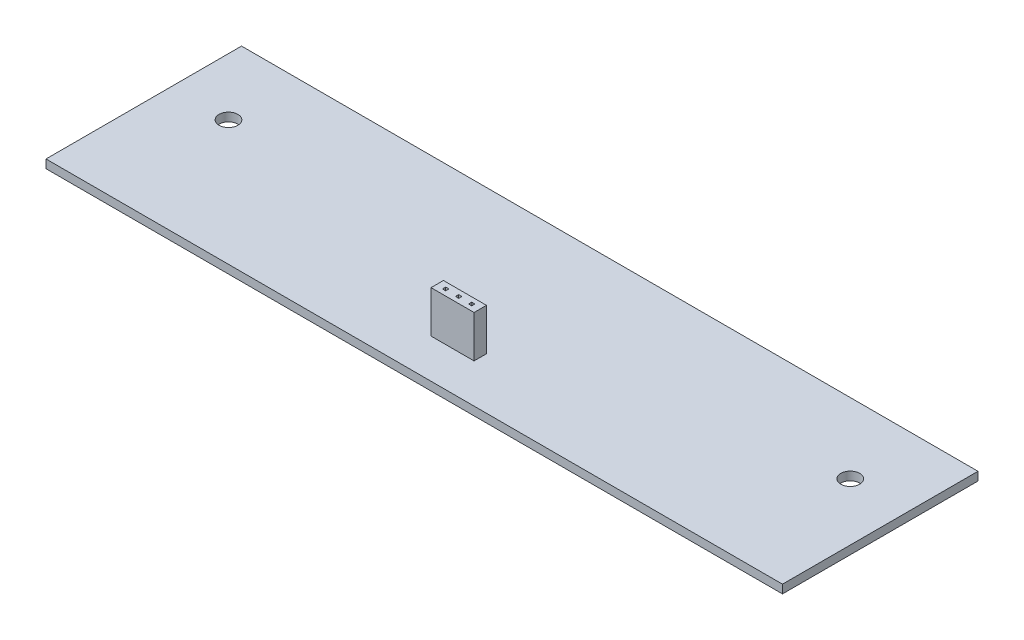
ISO-10303-21;
HEADER;
FILE_DESCRIPTION(('STEP AP214'),'2;1');
FILE_NAME('part.step','',(''),(''),'','','');
FILE_SCHEMA(('AUTOMOTIVE_DESIGN { 1 0 10303 214 1 1 1 1 }'));
ENDSEC;
DATA;
#1=APPLICATION_CONTEXT('core data for automotive mechanical design processes');
#2=APPLICATION_PROTOCOL_DEFINITION('international standard','automotive_design',2000,#1);
#3=PRODUCT_CONTEXT('',#1,'mechanical');
#4=PRODUCT('Part','Part','',(#3));
#5=PRODUCT_RELATED_PRODUCT_CATEGORY('part','',(#4));
#6=PRODUCT_DEFINITION_FORMATION('','',#4);
#7=PRODUCT_DEFINITION_CONTEXT('part definition',#1,'design');
#8=PRODUCT_DEFINITION('design','',#6,#7);
#9=PRODUCT_DEFINITION_SHAPE('','',#8);
#10=(LENGTH_UNIT() NAMED_UNIT(*) SI_UNIT(.MILLI.,.METRE.));
#11=(NAMED_UNIT(*) PLANE_ANGLE_UNIT() SI_UNIT($,.RADIAN.));
#12=(NAMED_UNIT(*) SI_UNIT($,.STERADIAN.) SOLID_ANGLE_UNIT());
#13=UNCERTAINTY_MEASURE_WITH_UNIT(LENGTH_MEASURE(1.E-05),#10,'distance_accuracy_value','');
#14=(GEOMETRIC_REPRESENTATION_CONTEXT(3) GLOBAL_UNCERTAINTY_ASSIGNED_CONTEXT((#13)) GLOBAL_UNIT_ASSIGNED_CONTEXT((#10,
#11,#12)) REPRESENTATION_CONTEXT('',''));
#15=CARTESIAN_POINT('',(0.,0.,0.));
#16=DIRECTION('',(0.,0.,1.));
#17=DIRECTION('',(1.,0.,0.));
#18=AXIS2_PLACEMENT_3D('',#15,#16,#17);
#19=CARTESIAN_POINT('',(71.755,1.651,-19.05));
#20=DIRECTION('',(-1.,0.,0.));
#21=DIRECTION('',(0.,0.,1.));
#22=AXIS2_PLACEMENT_3D('',#19,#20,#21);
#23=PLANE('',#22);
#24=DIRECTION('',(0.,0.,-1.));
#25=VECTOR('',#24,1.);
#26=CARTESIAN_POINT('',(71.755,0.,-19.05));
#27=LINE('',#26,#25);
#28=CARTESIAN_POINT('',(71.755,0.,19.05));
#29=VERTEX_POINT('',#28);
#30=CARTESIAN_POINT('',(71.755,0.,-19.05));
#31=VERTEX_POINT('',#30);
#32=EDGE_CURVE('E362',#29,#31,#27,.T.);
#33=ORIENTED_EDGE('',*,*,#32,.T.);
#34=DIRECTION('',(0.,-1.,0.));
#35=VECTOR('',#34,1.);
#36=CARTESIAN_POINT('',(71.755,1.651,-19.05));
#37=LINE('',#36,#35);
#38=CARTESIAN_POINT('',(71.755,1.651,-19.05));
#39=VERTEX_POINT('',#38);
#40=EDGE_CURVE('E11',#39,#31,#37,.T.);
#41=ORIENTED_EDGE('',*,*,#40,.F.);
#42=DIRECTION('',(0.,0.,-1.));
#43=VECTOR('',#42,1.);
#44=CARTESIAN_POINT('',(71.755,1.651,-19.05));
#45=LINE('',#44,#43);
#46=CARTESIAN_POINT('',(71.755,1.651,19.05));
#47=VERTEX_POINT('',#46);
#48=EDGE_CURVE('E374',#47,#39,#45,.T.);
#49=ORIENTED_EDGE('',*,*,#48,.F.);
#50=DIRECTION('',(0.,-1.,0.));
#51=VECTOR('',#50,1.);
#52=CARTESIAN_POINT('',(71.755,1.651,19.05));
#53=LINE('',#52,#51);
#54=EDGE_CURVE('E388',#47,#29,#53,.T.);
#55=ORIENTED_EDGE('',*,*,#54,.T.);
#56=EDGE_LOOP('',(#33,#41,#49,#55));
#57=FACE_BOUND('',#56,.T.);
#58=ADVANCED_FACE('F47',(#57),#23,.F.);
#59=CARTESIAN_POINT('',(-71.755,1.651,-19.05));
#60=DIRECTION('',(0.,0.,1.));
#61=DIRECTION('',(1.,0.,0.));
#62=AXIS2_PLACEMENT_3D('',#59,#60,#61);
#63=PLANE('',#62);
#64=DIRECTION('',(-1.,0.,0.));
#65=VECTOR('',#64,1.);
#66=CARTESIAN_POINT('',(-71.755,0.,-19.05));
#67=LINE('',#66,#65);
#68=CARTESIAN_POINT('',(-71.755,0.,-19.05));
#69=VERTEX_POINT('',#68);
#70=EDGE_CURVE('E392',#31,#69,#67,.T.);
#71=ORIENTED_EDGE('',*,*,#70,.T.);
#72=DIRECTION('',(0.,-1.,0.));
#73=VECTOR('',#72,1.);
#74=CARTESIAN_POINT('',(-71.755,1.651,-19.05));
#75=LINE('',#74,#73);
#76=CARTESIAN_POINT('',(-71.755,1.651,-19.05));
#77=VERTEX_POINT('',#76);
#78=EDGE_CURVE('E55',#77,#69,#75,.T.);
#79=ORIENTED_EDGE('',*,*,#78,.F.);
#80=DIRECTION('',(-1.,0.,0.));
#81=VECTOR('',#80,1.);
#82=CARTESIAN_POINT('',(-71.755,1.651,-19.05));
#83=LINE('',#82,#81);
#84=EDGE_CURVE('E378',#39,#77,#83,.T.);
#85=ORIENTED_EDGE('',*,*,#84,.F.);
#86=ORIENTED_EDGE('',*,*,#40,.T.);
#87=EDGE_LOOP('',(#71,#79,#85,#86));
#88=FACE_BOUND('',#87,.T.);
#89=ADVANCED_FACE('F428',(#88),#63,.F.);
#90=CARTESIAN_POINT('',(-71.755,1.651,-19.05));
#91=DIRECTION('',(1.,0.,0.));
#92=DIRECTION('',(0.,0.,-1.));
#93=AXIS2_PLACEMENT_3D('',#90,#91,#92);
#94=PLANE('',#93);
#95=DIRECTION('',(0.,0.,1.));
#96=VECTOR('',#95,1.);
#97=CARTESIAN_POINT('',(-71.755,0.,-19.05));
#98=LINE('',#97,#96);
#99=CARTESIAN_POINT('',(-71.755,0.,19.05));
#100=VERTEX_POINT('',#99);
#101=EDGE_CURVE('E395',#69,#100,#98,.T.);
#102=ORIENTED_EDGE('',*,*,#101,.T.);
#103=DIRECTION('',(0.,-1.,0.));
#104=VECTOR('',#103,1.);
#105=CARTESIAN_POINT('',(-71.755,1.651,19.05));
#106=LINE('',#105,#104);
#107=CARTESIAN_POINT('',(-71.755,1.651,19.05));
#108=VERTEX_POINT('',#107);
#109=EDGE_CURVE('E403',#108,#100,#106,.T.);
#110=ORIENTED_EDGE('',*,*,#109,.F.);
#111=DIRECTION('',(0.,0.,1.));
#112=VECTOR('',#111,1.);
#113=CARTESIAN_POINT('',(-71.755,1.651,-19.05));
#114=LINE('',#113,#112);
#115=EDGE_CURVE('E382',#77,#108,#114,.T.);
#116=ORIENTED_EDGE('',*,*,#115,.F.);
#117=ORIENTED_EDGE('',*,*,#78,.T.);
#118=EDGE_LOOP('',(#102,#110,#116,#117));
#119=FACE_BOUND('',#118,.T.);
#120=ADVANCED_FACE('F412',(#119),#94,.F.);
#121=CARTESIAN_POINT('',(-71.755,1.651,19.05));
#122=DIRECTION('',(0.,0.,-1.));
#123=DIRECTION('',(-1.,0.,0.));
#124=AXIS2_PLACEMENT_3D('',#121,#122,#123);
#125=PLANE('',#124);
#126=DIRECTION('',(1.,0.,0.));
#127=VECTOR('',#126,1.);
#128=CARTESIAN_POINT('',(-71.755,0.,19.05));
#129=LINE('',#128,#127);
#130=EDGE_CURVE('E379',#100,#29,#129,.T.);
#131=ORIENTED_EDGE('',*,*,#130,.T.);
#132=ORIENTED_EDGE('',*,*,#54,.F.);
#133=DIRECTION('',(1.,0.,0.));
#134=VECTOR('',#133,1.);
#135=CARTESIAN_POINT('',(-71.755,1.651,19.05));
#136=LINE('',#135,#134);
#137=EDGE_CURVE('E385',#108,#47,#136,.T.);
#138=ORIENTED_EDGE('',*,*,#137,.F.);
#139=ORIENTED_EDGE('',*,*,#109,.T.);
#140=EDGE_LOOP('',(#131,#132,#138,#139));
#141=FACE_BOUND('',#140,.T.);
#142=ADVANCED_FACE('F421',(#141),#125,.F.);
#143=CARTESIAN_POINT('',(0.,1.651,0.));
#144=DIRECTION('',(0.,1.,0.));
#145=DIRECTION('',(0.,0.,1.));
#146=AXIS2_PLACEMENT_3D('',#143,#144,#145);
#147=PLANE('',#146);
#148=DIRECTION('',(0.,0.,-1.));
#149=VECTOR('',#148,1.);
#150=CARTESIAN_POINT('',(-4.34569858588176,1.651,0.));
#151=LINE('',#150,#149);
#152=CARTESIAN_POINT('',(-4.34569858588176,1.651,11.43));
#153=VERTEX_POINT('',#152);
#154=CARTESIAN_POINT('',(-4.34569858588176,1.651,9.017));
#155=VERTEX_POINT('',#154);
#156=EDGE_CURVE('E304',#153,#155,#151,.T.);
#157=ORIENTED_EDGE('',*,*,#156,.T.);
#158=DIRECTION('',(1.,0.,0.));
#159=VECTOR('',#158,1.);
#160=CARTESIAN_POINT('',(0.,1.651,9.017));
#161=LINE('',#160,#159);
#162=CARTESIAN_POINT('',(4.03630141411824,1.651,9.017));
#163=VERTEX_POINT('',#162);
#164=EDGE_CURVE('E319',#155,#163,#161,.T.);
#165=ORIENTED_EDGE('',*,*,#164,.T.);
#166=DIRECTION('',(0.,0.,1.));
#167=VECTOR('',#166,1.);
#168=CARTESIAN_POINT('',(4.03630141411824,1.651,0.));
#169=LINE('',#168,#167);
#170=CARTESIAN_POINT('',(4.03630141411824,1.651,11.43));
#171=VERTEX_POINT('',#170);
#172=EDGE_CURVE('E337',#163,#171,#169,.T.);
#173=ORIENTED_EDGE('',*,*,#172,.T.);
#174=DIRECTION('',(1.,0.,0.));
#175=VECTOR('',#174,1.);
#176=CARTESIAN_POINT('',(0.,1.651,11.43));
#177=LINE('',#176,#175);
#178=EDGE_CURVE('E333',#153,#171,#177,.T.);
#179=ORIENTED_EDGE('',*,*,#178,.F.);
#180=EDGE_LOOP('',(#157,#165,#173,#179));
#181=FACE_BOUND('',#180,.T.);
#182=CARTESIAN_POINT('',(60.579,1.651,-5.334));
#183=DIRECTION('',(0.,1.,0.));
#184=DIRECTION('',(0.,0.,1.));
#185=AXIS2_PLACEMENT_3D('',#182,#183,#184);
#186=CIRCLE('',#185,1.8415);
#187=CARTESIAN_POINT('',(60.579,1.651,-3.4925));
#188=VERTEX_POINT('',#187);
#189=EDGE_CURVE('E363',#188,#188,#186,.T.);
#190=ORIENTED_EDGE('',*,*,#189,.F.);
#191=EDGE_LOOP('',(#190));
#192=FACE_BOUND('',#191,.T.);
#193=CARTESIAN_POINT('',(-60.579,1.651,-5.334));
#194=DIRECTION('',(0.,1.,0.));
#195=DIRECTION('',(0.,0.,-1.));
#196=AXIS2_PLACEMENT_3D('',#193,#194,#195);
#197=CIRCLE('',#196,1.8415);
#198=CARTESIAN_POINT('',(-60.579,1.651,-3.4925));
#199=VERTEX_POINT('',#198);
#200=EDGE_CURVE('E367',#199,#199,#197,.T.);
#201=ORIENTED_EDGE('',*,*,#200,.F.);
#202=EDGE_LOOP('',(#201));
#203=FACE_BOUND('',#202,.T.);
#204=ORIENTED_EDGE('',*,*,#48,.T.);
#205=ORIENTED_EDGE('',*,*,#84,.T.);
#206=ORIENTED_EDGE('',*,*,#115,.T.);
#207=ORIENTED_EDGE('',*,*,#137,.T.);
#208=EDGE_LOOP('',(#204,#205,#206,#207));
#209=FACE_BOUND('',#208,.T.);
#210=ADVANCED_FACE('F427',(#181,#192,#203,#209),#147,.T.);
#211=CARTESIAN_POINT('',(0.,0.,0.));
#212=DIRECTION('',(0.,1.,0.));
#213=DIRECTION('',(0.,0.,1.));
#214=AXIS2_PLACEMENT_3D('',#211,#212,#213);
#215=PLANE('',#214);
#216=CARTESIAN_POINT('',(60.579,0.,-5.334));
#217=DIRECTION('',(0.,1.,0.));
#218=DIRECTION('',(0.,0.,1.));
#219=AXIS2_PLACEMENT_3D('',#216,#217,#218);
#220=CIRCLE('',#219,1.8415);
#221=CARTESIAN_POINT('',(60.579,0.,-3.4925));
#222=VERTEX_POINT('',#221);
#223=EDGE_CURVE('E358',#222,#222,#220,.T.);
#224=ORIENTED_EDGE('',*,*,#223,.T.);
#225=EDGE_LOOP('',(#224));
#226=FACE_BOUND('',#225,.T.);
#227=CARTESIAN_POINT('',(-60.579,0.,-5.334));
#228=DIRECTION('',(0.,1.,0.));
#229=DIRECTION('',(0.,0.,-1.));
#230=AXIS2_PLACEMENT_3D('',#227,#228,#229);
#231=CIRCLE('',#230,1.8415);
#232=CARTESIAN_POINT('',(-60.579,0.,-3.4925));
#233=VERTEX_POINT('',#232);
#234=EDGE_CURVE('E357',#233,#233,#231,.T.);
#235=ORIENTED_EDGE('',*,*,#234,.T.);
#236=EDGE_LOOP('',(#235));
#237=FACE_BOUND('',#236,.T.);
#238=ORIENTED_EDGE('',*,*,#32,.F.);
#239=ORIENTED_EDGE('',*,*,#130,.F.);
#240=ORIENTED_EDGE('',*,*,#101,.F.);
#241=ORIENTED_EDGE('',*,*,#70,.F.);
#242=EDGE_LOOP('',(#238,#239,#240,#241));
#243=FACE_BOUND('',#242,.T.);
#244=ADVANCED_FACE('F418',(#226,#237,#243),#215,.F.);
#245=CARTESIAN_POINT('',(-60.579,0.,-5.334));
#246=DIRECTION('',(0.,1.,0.));
#247=DIRECTION('',(0.,0.,1.));
#248=AXIS2_PLACEMENT_3D('',#245,#246,#247);
#249=CYLINDRICAL_SURFACE('',#248,1.8415);
#250=CARTESIAN_POINT('',(-60.579,0.,-3.4925));
#251=CARTESIAN_POINT('',(-60.579,0.0171979166666667,-3.4925));
#252=CARTESIAN_POINT('',(-60.579,0.0343958333333333,-3.4925));
#253=CARTESIAN_POINT('',(-60.579,0.0687916666666667,-3.4925));
#254=CARTESIAN_POINT('',(-60.579,0.0859895833333333,-3.4925));
#255=CARTESIAN_POINT('',(-60.579,0.120385416666667,-3.4925));
#256=CARTESIAN_POINT('',(-60.579,0.137583333333333,-3.4925));
#257=CARTESIAN_POINT('',(-60.579,0.171979166666667,-3.4925));
#258=CARTESIAN_POINT('',(-60.579,0.189177083333333,-3.4925));
#259=CARTESIAN_POINT('',(-60.579,0.223572916666667,-3.4925));
#260=CARTESIAN_POINT('',(-60.579,0.240770833333333,-3.4925));
#261=CARTESIAN_POINT('',(-60.579,0.275166666666667,-3.4925));
#262=CARTESIAN_POINT('',(-60.579,0.292364583333333,-3.4925));
#263=CARTESIAN_POINT('',(-60.579,0.326760416666667,-3.4925));
#264=CARTESIAN_POINT('',(-60.579,0.343958333333333,-3.4925));
#265=CARTESIAN_POINT('',(-60.579,0.378354166666667,-3.4925));
#266=CARTESIAN_POINT('',(-60.579,0.395552083333333,-3.4925));
#267=CARTESIAN_POINT('',(-60.579,0.429947916666667,-3.4925));
#268=CARTESIAN_POINT('',(-60.579,0.447145833333333,-3.4925));
#269=CARTESIAN_POINT('',(-60.579,0.481541666666667,-3.4925));
#270=CARTESIAN_POINT('',(-60.579,0.498739583333333,-3.4925));
#271=CARTESIAN_POINT('',(-60.579,0.533135416666667,-3.4925));
#272=CARTESIAN_POINT('',(-60.579,0.550333333333333,-3.4925));
#273=CARTESIAN_POINT('',(-60.579,0.584729166666667,-3.4925));
#274=CARTESIAN_POINT('',(-60.579,0.601927083333333,-3.4925));
#275=CARTESIAN_POINT('',(-60.579,0.636322916666667,-3.4925));
#276=CARTESIAN_POINT('',(-60.579,0.653520833333333,-3.4925));
#277=CARTESIAN_POINT('',(-60.579,0.687916666666667,-3.4925));
#278=CARTESIAN_POINT('',(-60.579,0.705114583333333,-3.4925));
#279=CARTESIAN_POINT('',(-60.579,0.739510416666667,-3.4925));
#280=CARTESIAN_POINT('',(-60.579,0.756708333333333,-3.4925));
#281=CARTESIAN_POINT('',(-60.579,0.791104166666667,-3.4925));
#282=CARTESIAN_POINT('',(-60.579,0.808302083333333,-3.4925));
#283=CARTESIAN_POINT('',(-60.579,0.842697916666667,-3.4925));
#284=CARTESIAN_POINT('',(-60.579,0.859895833333333,-3.4925));
#285=CARTESIAN_POINT('',(-60.579,0.894291666666667,-3.4925));
#286=CARTESIAN_POINT('',(-60.579,0.911489583333333,-3.4925));
#287=CARTESIAN_POINT('',(-60.579,0.945885416666667,-3.4925));
#288=CARTESIAN_POINT('',(-60.579,0.963083333333333,-3.4925));
#289=CARTESIAN_POINT('',(-60.579,0.997479166666666,-3.4925));
#290=CARTESIAN_POINT('',(-60.579,1.01467708333333,-3.4925));
#291=CARTESIAN_POINT('',(-60.579,1.04907291666667,-3.4925));
#292=CARTESIAN_POINT('',(-60.579,1.06627083333333,-3.4925));
#293=CARTESIAN_POINT('',(-60.579,1.10066666666667,-3.4925));
#294=CARTESIAN_POINT('',(-60.579,1.11786458333333,-3.4925));
#295=CARTESIAN_POINT('',(-60.579,1.15226041666667,-3.4925));
#296=CARTESIAN_POINT('',(-60.579,1.16945833333333,-3.4925));
#297=CARTESIAN_POINT('',(-60.579,1.20385416666667,-3.4925));
#298=CARTESIAN_POINT('',(-60.579,1.22105208333333,-3.4925));
#299=CARTESIAN_POINT('',(-60.579,1.25544791666667,-3.4925));
#300=CARTESIAN_POINT('',(-60.579,1.27264583333333,-3.4925));
#301=CARTESIAN_POINT('',(-60.579,1.30704166666667,-3.4925));
#302=CARTESIAN_POINT('',(-60.579,1.32423958333333,-3.4925));
#303=CARTESIAN_POINT('',(-60.579,1.35863541666667,-3.4925));
#304=CARTESIAN_POINT('',(-60.579,1.37583333333333,-3.4925));
#305=CARTESIAN_POINT('',(-60.579,1.41022916666667,-3.4925));
#306=CARTESIAN_POINT('',(-60.579,1.42742708333333,-3.4925));
#307=CARTESIAN_POINT('',(-60.579,1.46182291666667,-3.4925));
#308=CARTESIAN_POINT('',(-60.579,1.47902083333333,-3.4925));
#309=CARTESIAN_POINT('',(-60.579,1.51341666666667,-3.4925));
#310=CARTESIAN_POINT('',(-60.579,1.53061458333333,-3.4925));
#311=CARTESIAN_POINT('',(-60.579,1.56501041666667,-3.4925));
#312=CARTESIAN_POINT('',(-60.579,1.58220833333333,-3.4925));
#313=CARTESIAN_POINT('',(-60.579,1.61660416666667,-3.4925));
#314=CARTESIAN_POINT('',(-60.579,1.63380208333333,-3.4925));
#315=CARTESIAN_POINT('',(-60.579,1.651,-3.4925));
#316=B_SPLINE_CURVE_WITH_KNOTS('',3,(#250,#251,#252,#253,#254,#255,#256,#257,#258,#259,#260,
#261,#262,#263,#264,#265,#266,#267,#268,#269,#270,#271,#272,#273,#274,#275,#276,#277,#278,#279,
#280,#281,#282,#283,#284,#285,#286,#287,#288,#289,#290,#291,#292,#293,#294,#295,#296,#297,#298,
#299,#300,#301,#302,#303,#304,#305,#306,#307,#308,#309,#310,#311,#312,#313,#314,#315),
.UNSPECIFIED.,.F.,.F.,(4,2,2,2,2,2,2,2,2,2,2,2,2,2,2,2,2,2,2,2,2,2,2,2,2,2,2,2,2,2,2,2,4),(0.,
0.05159375,0.1031875,0.15478125,0.206375,0.25796875,0.3095625,0.36115625,0.41275,0.46434375,
0.5159375,0.56753125,0.619125,0.67071875,0.7223125,0.77390625,0.8255,0.87709375,0.9286875,
0.98028125,1.031875,1.08346875,1.1350625,1.18665625,1.23825,1.28984375,1.3414375,1.39303125,
1.444625,1.49621875,1.5478125,1.59940625,1.651),.UNSPECIFIED.);
#317=EDGE_CURVE('BSEAM440',#233,#199,#316,.T.);
#318=ORIENTED_EDGE('',*,*,#234,.F.);
#319=ORIENTED_EDGE('',*,*,#200,.T.);
#320=ORIENTED_EDGE('',*,*,#317,.T.);
#321=ORIENTED_EDGE('',*,*,#317,.F.);
#322=EDGE_LOOP('',(#318,#320,#319,#321));
#323=FACE_BOUND('',#322,.T.);
#324=ADVANCED_FACE('F440',(#323),#249,.F.);
#325=CARTESIAN_POINT('',(60.579,0.,-5.334));
#326=DIRECTION('',(0.,1.,0.));
#327=DIRECTION('',(0.,0.,1.));
#328=AXIS2_PLACEMENT_3D('',#325,#326,#327);
#329=CYLINDRICAL_SURFACE('',#328,1.8415);
#330=CARTESIAN_POINT('',(60.579,0.,-3.4925));
#331=CARTESIAN_POINT('',(60.579,0.0171979166666667,-3.4925));
#332=CARTESIAN_POINT('',(60.579,0.0343958333333333,-3.4925));
#333=CARTESIAN_POINT('',(60.579,0.0687916666666667,-3.4925));
#334=CARTESIAN_POINT('',(60.579,0.0859895833333333,-3.4925));
#335=CARTESIAN_POINT('',(60.579,0.120385416666667,-3.4925));
#336=CARTESIAN_POINT('',(60.579,0.137583333333333,-3.4925));
#337=CARTESIAN_POINT('',(60.579,0.171979166666667,-3.4925));
#338=CARTESIAN_POINT('',(60.579,0.189177083333333,-3.4925));
#339=CARTESIAN_POINT('',(60.579,0.223572916666667,-3.4925));
#340=CARTESIAN_POINT('',(60.579,0.240770833333333,-3.4925));
#341=CARTESIAN_POINT('',(60.579,0.275166666666667,-3.4925));
#342=CARTESIAN_POINT('',(60.579,0.292364583333333,-3.4925));
#343=CARTESIAN_POINT('',(60.579,0.326760416666667,-3.4925));
#344=CARTESIAN_POINT('',(60.579,0.343958333333333,-3.4925));
#345=CARTESIAN_POINT('',(60.579,0.378354166666667,-3.4925));
#346=CARTESIAN_POINT('',(60.579,0.395552083333333,-3.4925));
#347=CARTESIAN_POINT('',(60.579,0.429947916666667,-3.4925));
#348=CARTESIAN_POINT('',(60.579,0.447145833333333,-3.4925));
#349=CARTESIAN_POINT('',(60.579,0.481541666666667,-3.4925));
#350=CARTESIAN_POINT('',(60.579,0.498739583333333,-3.4925));
#351=CARTESIAN_POINT('',(60.579,0.533135416666667,-3.4925));
#352=CARTESIAN_POINT('',(60.579,0.550333333333333,-3.4925));
#353=CARTESIAN_POINT('',(60.579,0.584729166666667,-3.4925));
#354=CARTESIAN_POINT('',(60.579,0.601927083333333,-3.4925));
#355=CARTESIAN_POINT('',(60.579,0.636322916666667,-3.4925));
#356=CARTESIAN_POINT('',(60.579,0.653520833333333,-3.4925));
#357=CARTESIAN_POINT('',(60.579,0.687916666666667,-3.4925));
#358=CARTESIAN_POINT('',(60.579,0.705114583333333,-3.4925));
#359=CARTESIAN_POINT('',(60.579,0.739510416666667,-3.4925));
#360=CARTESIAN_POINT('',(60.579,0.756708333333333,-3.4925));
#361=CARTESIAN_POINT('',(60.579,0.791104166666667,-3.4925));
#362=CARTESIAN_POINT('',(60.579,0.808302083333333,-3.4925));
#363=CARTESIAN_POINT('',(60.579,0.842697916666667,-3.4925));
#364=CARTESIAN_POINT('',(60.579,0.859895833333333,-3.4925));
#365=CARTESIAN_POINT('',(60.579,0.894291666666667,-3.4925));
#366=CARTESIAN_POINT('',(60.579,0.911489583333333,-3.4925));
#367=CARTESIAN_POINT('',(60.579,0.945885416666667,-3.4925));
#368=CARTESIAN_POINT('',(60.579,0.963083333333333,-3.4925));
#369=CARTESIAN_POINT('',(60.579,0.997479166666666,-3.4925));
#370=CARTESIAN_POINT('',(60.579,1.01467708333333,-3.4925));
#371=CARTESIAN_POINT('',(60.579,1.04907291666667,-3.4925));
#372=CARTESIAN_POINT('',(60.579,1.06627083333333,-3.4925));
#373=CARTESIAN_POINT('',(60.579,1.10066666666667,-3.4925));
#374=CARTESIAN_POINT('',(60.579,1.11786458333333,-3.4925));
#375=CARTESIAN_POINT('',(60.579,1.15226041666667,-3.4925));
#376=CARTESIAN_POINT('',(60.579,1.16945833333333,-3.4925));
#377=CARTESIAN_POINT('',(60.579,1.20385416666667,-3.4925));
#378=CARTESIAN_POINT('',(60.579,1.22105208333333,-3.4925));
#379=CARTESIAN_POINT('',(60.579,1.25544791666667,-3.4925));
#380=CARTESIAN_POINT('',(60.579,1.27264583333333,-3.4925));
#381=CARTESIAN_POINT('',(60.579,1.30704166666667,-3.4925));
#382=CARTESIAN_POINT('',(60.579,1.32423958333333,-3.4925));
#383=CARTESIAN_POINT('',(60.579,1.35863541666667,-3.4925));
#384=CARTESIAN_POINT('',(60.579,1.37583333333333,-3.4925));
#385=CARTESIAN_POINT('',(60.579,1.41022916666667,-3.4925));
#386=CARTESIAN_POINT('',(60.579,1.42742708333333,-3.4925));
#387=CARTESIAN_POINT('',(60.579,1.46182291666667,-3.4925));
#388=CARTESIAN_POINT('',(60.579,1.47902083333333,-3.4925));
#389=CARTESIAN_POINT('',(60.579,1.51341666666667,-3.4925));
#390=CARTESIAN_POINT('',(60.579,1.53061458333333,-3.4925));
#391=CARTESIAN_POINT('',(60.579,1.56501041666667,-3.4925));
#392=CARTESIAN_POINT('',(60.579,1.58220833333333,-3.4925));
#393=CARTESIAN_POINT('',(60.579,1.61660416666667,-3.4925));
#394=CARTESIAN_POINT('',(60.579,1.63380208333333,-3.4925));
#395=CARTESIAN_POINT('',(60.579,1.651,-3.4925));
#396=B_SPLINE_CURVE_WITH_KNOTS('',3,(#330,#331,#332,#333,#334,#335,#336,#337,#338,#339,#340,
#341,#342,#343,#344,#345,#346,#347,#348,#349,#350,#351,#352,#353,#354,#355,#356,#357,#358,#359,
#360,#361,#362,#363,#364,#365,#366,#367,#368,#369,#370,#371,#372,#373,#374,#375,#376,#377,#378,
#379,#380,#381,#382,#383,#384,#385,#386,#387,#388,#389,#390,#391,#392,#393,#394,#395),
.UNSPECIFIED.,.F.,.F.,(4,2,2,2,2,2,2,2,2,2,2,2,2,2,2,2,2,2,2,2,2,2,2,2,2,2,2,2,2,2,2,2,4),(0.,
0.05159375,0.1031875,0.15478125,0.206375,0.25796875,0.3095625,0.36115625,0.41275,0.46434375,
0.5159375,0.56753125,0.619125,0.67071875,0.7223125,0.77390625,0.8255,0.87709375,0.9286875,
0.98028125,1.031875,1.08346875,1.1350625,1.18665625,1.23825,1.28984375,1.3414375,1.39303125,
1.444625,1.49621875,1.5478125,1.59940625,1.651),.UNSPECIFIED.);
#397=EDGE_CURVE('BSEAM447',#222,#188,#396,.T.);
#398=ORIENTED_EDGE('',*,*,#223,.F.);
#399=ORIENTED_EDGE('',*,*,#189,.T.);
#400=ORIENTED_EDGE('',*,*,#397,.T.);
#401=ORIENTED_EDGE('',*,*,#397,.F.);
#402=EDGE_LOOP('',(#398,#400,#399,#401));
#403=FACE_BOUND('',#402,.T.);
#404=ADVANCED_FACE('F447',(#403),#329,.F.);
#405=CARTESIAN_POINT('',(-4.34569858588176,9.8298,0.));
#406=DIRECTION('',(-1.,0.,0.));
#407=DIRECTION('',(0.,0.,1.));
#408=AXIS2_PLACEMENT_3D('',#405,#406,#407);
#409=PLANE('',#408);
#410=ORIENTED_EDGE('',*,*,#156,.F.);
#411=DIRECTION('',(0.,-1.,0.));
#412=VECTOR('',#411,1.);
#413=CARTESIAN_POINT('',(-4.34569858588176,9.8298,11.43));
#414=LINE('',#413,#412);
#415=CARTESIAN_POINT('',(-4.34569858588176,9.8298,11.43));
#416=VERTEX_POINT('',#415);
#417=EDGE_CURVE('E353',#416,#153,#414,.T.);
#418=ORIENTED_EDGE('',*,*,#417,.F.);
#419=DIRECTION('',(0.,0.,-1.));
#420=VECTOR('',#419,1.);
#421=CARTESIAN_POINT('',(-4.34569858588176,9.8298,0.));
#422=LINE('',#421,#420);
#423=CARTESIAN_POINT('',(-4.34569858588176,9.8298,9.017));
#424=VERTEX_POINT('',#423);
#425=EDGE_CURVE('E314',#416,#424,#422,.T.);
#426=ORIENTED_EDGE('',*,*,#425,.T.);
#427=DIRECTION('',(0.,-1.,0.));
#428=VECTOR('',#427,1.);
#429=CARTESIAN_POINT('',(-4.34569858588176,9.8298,9.017));
#430=LINE('',#429,#428);
#431=EDGE_CURVE('E330',#424,#155,#430,.T.);
#432=ORIENTED_EDGE('',*,*,#431,.T.);
#433=EDGE_LOOP('',(#410,#418,#426,#432));
#434=FACE_BOUND('',#433,.T.);
#435=ADVANCED_FACE('F451',(#434),#409,.T.);
#436=CARTESIAN_POINT('',(0.,9.8298,11.43));
#437=DIRECTION('',(0.,0.,-1.));
#438=DIRECTION('',(-1.,0.,0.));
#439=AXIS2_PLACEMENT_3D('',#436,#437,#438);
#440=PLANE('',#439);
#441=ORIENTED_EDGE('',*,*,#178,.T.);
#442=DIRECTION('',(0.,-1.,0.));
#443=VECTOR('',#442,1.);
#444=CARTESIAN_POINT('',(4.03630141411824,9.8298,11.43));
#445=LINE('',#444,#443);
#446=CARTESIAN_POINT('',(4.03630141411824,9.8298,11.43));
#447=VERTEX_POINT('',#446);
#448=EDGE_CURVE('E349',#447,#171,#445,.T.);
#449=ORIENTED_EDGE('',*,*,#448,.F.);
#450=DIRECTION('',(1.,0.,0.));
#451=VECTOR('',#450,1.);
#452=CARTESIAN_POINT('',(0.,9.8298,11.43));
#453=LINE('',#452,#451);
#454=EDGE_CURVE('E318',#416,#447,#453,.T.);
#455=ORIENTED_EDGE('',*,*,#454,.F.);
#456=ORIENTED_EDGE('',*,*,#417,.T.);
#457=EDGE_LOOP('',(#441,#449,#455,#456));
#458=FACE_BOUND('',#457,.T.);
#459=ADVANCED_FACE('F455',(#458),#440,.F.);
#460=CARTESIAN_POINT('',(4.03630141411824,9.8298,0.));
#461=DIRECTION('',(1.,0.,0.));
#462=DIRECTION('',(0.,0.,-1.));
#463=AXIS2_PLACEMENT_3D('',#460,#461,#462);
#464=PLANE('',#463);
#465=ORIENTED_EDGE('',*,*,#172,.F.);
#466=DIRECTION('',(0.,-1.,0.));
#467=VECTOR('',#466,1.);
#468=CARTESIAN_POINT('',(4.03630141411824,9.8298,9.017));
#469=LINE('',#468,#467);
#470=CARTESIAN_POINT('',(4.03630141411824,9.8298,9.017));
#471=VERTEX_POINT('',#470);
#472=EDGE_CURVE('E345',#471,#163,#469,.T.);
#473=ORIENTED_EDGE('',*,*,#472,.F.);
#474=DIRECTION('',(0.,0.,1.));
#475=VECTOR('',#474,1.);
#476=CARTESIAN_POINT('',(4.03630141411824,9.8298,0.));
#477=LINE('',#476,#475);
#478=EDGE_CURVE('E322',#471,#447,#477,.T.);
#479=ORIENTED_EDGE('',*,*,#478,.T.);
#480=ORIENTED_EDGE('',*,*,#448,.T.);
#481=EDGE_LOOP('',(#465,#473,#479,#480));
#482=FACE_BOUND('',#481,.T.);
#483=ADVANCED_FACE('F459',(#482),#464,.T.);
#484=CARTESIAN_POINT('',(0.,9.8298,9.017));
#485=DIRECTION('',(0.,0.,-1.));
#486=DIRECTION('',(-1.,0.,0.));
#487=AXIS2_PLACEMENT_3D('',#484,#485,#486);
#488=PLANE('',#487);
#489=ORIENTED_EDGE('',*,*,#164,.F.);
#490=ORIENTED_EDGE('',*,*,#431,.F.);
#491=DIRECTION('',(1.,0.,0.));
#492=VECTOR('',#491,1.);
#493=CARTESIAN_POINT('',(0.,9.8298,9.017));
#494=LINE('',#493,#492);
#495=EDGE_CURVE('E326',#424,#471,#494,.T.);
#496=ORIENTED_EDGE('',*,*,#495,.T.);
#497=ORIENTED_EDGE('',*,*,#472,.T.);
#498=EDGE_LOOP('',(#489,#490,#496,#497));
#499=FACE_BOUND('',#498,.T.);
#500=ADVANCED_FACE('F463',(#499),#488,.T.);
#501=CARTESIAN_POINT('',(0.,9.8298,0.));
#502=DIRECTION('',(0.,1.,0.));
#503=DIRECTION('',(0.,0.,1.));
#504=AXIS2_PLACEMENT_3D('',#501,#502,#503);
#505=PLANE('',#504);
#506=DIRECTION('',(0.,0.,-1.));
#507=VECTOR('',#506,1.);
#508=CARTESIAN_POINT('',(2.70280141411824,9.8298,9.906));
#509=LINE('',#508,#507);
#510=CARTESIAN_POINT('',(2.70280141411824,9.8298,10.541));
#511=VERTEX_POINT('',#510);
#512=CARTESIAN_POINT('',(2.70280141411824,9.8298,9.906));
#513=VERTEX_POINT('',#512);
#514=EDGE_CURVE('E62',#511,#513,#509,.T.);
#515=ORIENTED_EDGE('',*,*,#514,.F.);
#516=DIRECTION('',(1.,0.,0.));
#517=VECTOR('',#516,1.);
#518=CARTESIAN_POINT('',(2.06780141411824,9.8298,10.541));
#519=LINE('',#518,#517);
#520=CARTESIAN_POINT('',(2.06780141411824,9.8298,10.541));
#521=VERTEX_POINT('',#520);
#522=EDGE_CURVE('E244',#521,#511,#519,.T.);
#523=ORIENTED_EDGE('',*,*,#522,.F.);
#524=DIRECTION('',(0.,0.,1.));
#525=VECTOR('',#524,1.);
#526=CARTESIAN_POINT('',(2.06780141411824,9.8298,9.906));
#527=LINE('',#526,#525);
#528=CARTESIAN_POINT('',(2.06780141411824,9.8298,9.906));
#529=VERTEX_POINT('',#528);
#530=EDGE_CURVE('E248',#529,#521,#527,.T.);
#531=ORIENTED_EDGE('',*,*,#530,.F.);
#532=DIRECTION('',(-1.,0.,0.));
#533=VECTOR('',#532,1.);
#534=CARTESIAN_POINT('',(2.06780141411824,9.8298,9.906));
#535=LINE('',#534,#533);
#536=EDGE_CURVE('E253',#513,#529,#535,.T.);
#537=ORIENTED_EDGE('',*,*,#536,.F.);
#538=EDGE_LOOP('',(#515,#523,#531,#537));
#539=FACE_BOUND('',#538,.T.);
#540=DIRECTION('',(0.,0.,-1.));
#541=VECTOR('',#540,1.);
#542=CARTESIAN_POINT('',(-2.37719858588176,9.8298,9.906));
#543=LINE('',#542,#541);
#544=CARTESIAN_POINT('',(-2.37719858588176,9.8298,10.541));
#545=VERTEX_POINT('',#544);
#546=CARTESIAN_POINT('',(-2.37719858588176,9.8298,9.906));
#547=VERTEX_POINT('',#546);
#548=EDGE_CURVE('E70',#545,#547,#543,.T.);
#549=ORIENTED_EDGE('',*,*,#548,.F.);
#550=DIRECTION('',(1.,0.,0.));
#551=VECTOR('',#550,1.);
#552=CARTESIAN_POINT('',(-3.01219858588176,9.8298,10.541));
#553=LINE('',#552,#551);
#554=CARTESIAN_POINT('',(-3.01219858588176,9.8298,10.541));
#555=VERTEX_POINT('',#554);
#556=EDGE_CURVE('E194',#555,#545,#553,.T.);
#557=ORIENTED_EDGE('',*,*,#556,.F.);
#558=DIRECTION('',(0.,0.,1.));
#559=VECTOR('',#558,1.);
#560=CARTESIAN_POINT('',(-3.01219858588176,9.8298,9.906));
#561=LINE('',#560,#559);
#562=CARTESIAN_POINT('',(-3.01219858588176,9.8298,9.906));
#563=VERTEX_POINT('',#562);
#564=EDGE_CURVE('E200',#563,#555,#561,.T.);
#565=ORIENTED_EDGE('',*,*,#564,.F.);
#566=DIRECTION('',(-1.,0.,0.));
#567=VECTOR('',#566,1.);
#568=CARTESIAN_POINT('',(-3.01219858588176,9.8298,9.906));
#569=LINE('',#568,#567);
#570=EDGE_CURVE('E206',#547,#563,#569,.T.);
#571=ORIENTED_EDGE('',*,*,#570,.F.);
#572=EDGE_LOOP('',(#549,#557,#565,#571));
#573=FACE_BOUND('',#572,.T.);
#574=DIRECTION('',(0.,0.,-1.));
#575=VECTOR('',#574,1.);
#576=CARTESIAN_POINT('',(0.162801414118239,9.8298,9.906));
#577=LINE('',#576,#575);
#578=CARTESIAN_POINT('',(0.162801414118239,9.8298,10.541));
#579=VERTEX_POINT('',#578);
#580=CARTESIAN_POINT('',(0.162801414118239,9.8298,9.906));
#581=VERTEX_POINT('',#580);
#582=EDGE_CURVE('E208',#579,#581,#577,.T.);
#583=ORIENTED_EDGE('',*,*,#582,.F.);
#584=DIRECTION('',(1.,0.,0.));
#585=VECTOR('',#584,1.);
#586=CARTESIAN_POINT('',(-0.472198585881761,9.8298,10.541));
#587=LINE('',#586,#585);
#588=CARTESIAN_POINT('',(-0.472198585881761,9.8298,10.541));
#589=VERTEX_POINT('',#588);
#590=EDGE_CURVE('E278',#589,#579,#587,.T.);
#591=ORIENTED_EDGE('',*,*,#590,.F.);
#592=DIRECTION('',(0.,0.,1.));
#593=VECTOR('',#592,1.);
#594=CARTESIAN_POINT('',(-0.472198585881761,9.8298,9.906));
#595=LINE('',#594,#593);
#596=CARTESIAN_POINT('',(-0.472198585881761,9.8298,9.906));
#597=VERTEX_POINT('',#596);
#598=EDGE_CURVE('E294',#597,#589,#595,.T.);
#599=ORIENTED_EDGE('',*,*,#598,.F.);
#600=DIRECTION('',(-1.,0.,0.));
#601=VECTOR('',#600,1.);
#602=CARTESIAN_POINT('',(-0.472198585881761,9.8298,9.906));
#603=LINE('',#602,#601);
#604=EDGE_CURVE('E212',#581,#597,#603,.T.);
#605=ORIENTED_EDGE('',*,*,#604,.F.);
#606=EDGE_LOOP('',(#583,#591,#599,#605));
#607=FACE_BOUND('',#606,.T.);
#608=ORIENTED_EDGE('',*,*,#425,.F.);
#609=ORIENTED_EDGE('',*,*,#454,.T.);
#610=ORIENTED_EDGE('',*,*,#478,.F.);
#611=ORIENTED_EDGE('',*,*,#495,.F.);
#612=EDGE_LOOP('',(#608,#609,#610,#611));
#613=FACE_BOUND('',#612,.T.);
#614=ADVANCED_FACE('F203',(#539,#573,#607,#613),#505,.T.);
#615=CARTESIAN_POINT('',(0.162801414118239,4.7498,9.906));
#616=DIRECTION('',(1.,0.,0.));
#617=DIRECTION('',(0.,0.,-1.));
#618=AXIS2_PLACEMENT_3D('',#615,#616,#617);
#619=PLANE('',#618);
#620=ORIENTED_EDGE('',*,*,#582,.T.);
#621=DIRECTION('',(0.,1.,0.));
#622=VECTOR('',#621,1.);
#623=CARTESIAN_POINT('',(0.162801414118239,4.7498,9.906));
#624=LINE('',#623,#622);
#625=CARTESIAN_POINT('',(0.162801414118239,4.7498,9.906));
#626=VERTEX_POINT('',#625);
#627=EDGE_CURVE('E289',#626,#581,#624,.T.);
#628=ORIENTED_EDGE('',*,*,#627,.F.);
#629=DIRECTION('',(0.,0.,-1.));
#630=VECTOR('',#629,1.);
#631=CARTESIAN_POINT('',(0.162801414118239,4.7498,9.906));
#632=LINE('',#631,#630);
#633=CARTESIAN_POINT('',(0.162801414118239,4.7498,10.541));
#634=VERTEX_POINT('',#633);
#635=EDGE_CURVE('E273',#634,#626,#632,.T.);
#636=ORIENTED_EDGE('',*,*,#635,.F.);
#637=DIRECTION('',(0.,1.,0.));
#638=VECTOR('',#637,1.);
#639=CARTESIAN_POINT('',(0.162801414118239,4.7498,10.541));
#640=LINE('',#639,#638);
#641=EDGE_CURVE('E301',#634,#579,#640,.T.);
#642=ORIENTED_EDGE('',*,*,#641,.T.);
#643=EDGE_LOOP('',(#620,#628,#636,#642));
#644=FACE_BOUND('',#643,.T.);
#645=ADVANCED_FACE('F470',(#644),#619,.F.);
#646=CARTESIAN_POINT('',(-0.472198585881761,4.7498,10.541));
#647=DIRECTION('',(0.,0.,1.));
#648=DIRECTION('',(1.,0.,0.));
#649=AXIS2_PLACEMENT_3D('',#646,#647,#648);
#650=PLANE('',#649);
#651=ORIENTED_EDGE('',*,*,#590,.T.);
#652=ORIENTED_EDGE('',*,*,#641,.F.);
#653=DIRECTION('',(1.,0.,0.));
#654=VECTOR('',#653,1.);
#655=CARTESIAN_POINT('',(-0.472198585881761,4.7498,10.541));
#656=LINE('',#655,#654);
#657=CARTESIAN_POINT('',(-0.472198585881761,4.7498,10.541));
#658=VERTEX_POINT('',#657);
#659=EDGE_CURVE('E286',#658,#634,#656,.T.);
#660=ORIENTED_EDGE('',*,*,#659,.F.);
#661=DIRECTION('',(0.,1.,0.));
#662=VECTOR('',#661,1.);
#663=CARTESIAN_POINT('',(-0.472198585881761,4.7498,10.541));
#664=LINE('',#663,#662);
#665=EDGE_CURVE('E305',#658,#589,#664,.T.);
#666=ORIENTED_EDGE('',*,*,#665,.T.);
#667=EDGE_LOOP('',(#651,#652,#660,#666));
#668=FACE_BOUND('',#667,.T.);
#669=ADVANCED_FACE('F474',(#668),#650,.F.);
#670=CARTESIAN_POINT('',(-0.472198585881761,4.7498,9.906));
#671=DIRECTION('',(-1.,0.,0.));
#672=DIRECTION('',(0.,0.,1.));
#673=AXIS2_PLACEMENT_3D('',#670,#671,#672);
#674=PLANE('',#673);
#675=ORIENTED_EDGE('',*,*,#598,.T.);
#676=ORIENTED_EDGE('',*,*,#665,.F.);
#677=DIRECTION('',(0.,0.,1.));
#678=VECTOR('',#677,1.);
#679=CARTESIAN_POINT('',(-0.472198585881761,4.7498,9.906));
#680=LINE('',#679,#678);
#681=CARTESIAN_POINT('',(-0.472198585881761,4.7498,9.906));
#682=VERTEX_POINT('',#681);
#683=EDGE_CURVE('E282',#682,#658,#680,.T.);
#684=ORIENTED_EDGE('',*,*,#683,.F.);
#685=DIRECTION('',(0.,1.,0.));
#686=VECTOR('',#685,1.);
#687=CARTESIAN_POINT('',(-0.472198585881761,4.7498,9.906));
#688=LINE('',#687,#686);
#689=EDGE_CURVE('E308',#682,#597,#688,.T.);
#690=ORIENTED_EDGE('',*,*,#689,.T.);
#691=EDGE_LOOP('',(#675,#676,#684,#690));
#692=FACE_BOUND('',#691,.T.);
#693=ADVANCED_FACE('F480',(#692),#674,.F.);
#694=CARTESIAN_POINT('',(-0.472198585881761,4.7498,9.906));
#695=DIRECTION('',(0.,0.,-1.));
#696=DIRECTION('',(-1.,0.,0.));
#697=AXIS2_PLACEMENT_3D('',#694,#695,#696);
#698=PLANE('',#697);
#699=ORIENTED_EDGE('',*,*,#604,.T.);
#700=ORIENTED_EDGE('',*,*,#689,.F.);
#701=DIRECTION('',(-1.,0.,0.));
#702=VECTOR('',#701,1.);
#703=CARTESIAN_POINT('',(-0.472198585881761,4.7498,9.906));
#704=LINE('',#703,#702);
#705=EDGE_CURVE('E277',#626,#682,#704,.T.);
#706=ORIENTED_EDGE('',*,*,#705,.F.);
#707=ORIENTED_EDGE('',*,*,#627,.T.);
#708=EDGE_LOOP('',(#699,#700,#706,#707));
#709=FACE_BOUND('',#708,.T.);
#710=ADVANCED_FACE('F476',(#709),#698,.F.);
#711=CARTESIAN_POINT('',(0.,4.7498,0.));
#712=DIRECTION('',(0.,1.,0.));
#713=DIRECTION('',(0.,0.,1.));
#714=AXIS2_PLACEMENT_3D('',#711,#712,#713);
#715=PLANE('',#714);
#716=ORIENTED_EDGE('',*,*,#635,.T.);
#717=ORIENTED_EDGE('',*,*,#705,.T.);
#718=ORIENTED_EDGE('',*,*,#683,.T.);
#719=ORIENTED_EDGE('',*,*,#659,.T.);
#720=EDGE_LOOP('',(#716,#717,#718,#719));
#721=FACE_BOUND('',#720,.T.);
#722=ADVANCED_FACE('F479',(#721),#715,.T.);
#723=CARTESIAN_POINT('',(-2.37719858588176,4.7498,9.906));
#724=DIRECTION('',(1.,0.,0.));
#725=DIRECTION('',(0.,0.,-1.));
#726=AXIS2_PLACEMENT_3D('',#723,#724,#725);
#727=PLANE('',#726);
#728=ORIENTED_EDGE('',*,*,#548,.T.);
#729=DIRECTION('',(0.,1.,0.));
#730=VECTOR('',#729,1.);
#731=CARTESIAN_POINT('',(-2.37719858588176,4.7498,9.906));
#732=LINE('',#731,#730);
#733=CARTESIAN_POINT('',(-2.37719858588176,4.7498,9.906));
#734=VERTEX_POINT('',#733);
#735=EDGE_CURVE('E221',#734,#547,#732,.T.);
#736=ORIENTED_EDGE('',*,*,#735,.F.);
#737=DIRECTION('',(0.,0.,-1.));
#738=VECTOR('',#737,1.);
#739=CARTESIAN_POINT('',(-2.37719858588176,4.7498,9.906));
#740=LINE('',#739,#738);
#741=CARTESIAN_POINT('',(-2.37719858588176,4.7498,10.541));
#742=VERTEX_POINT('',#741);
#743=EDGE_CURVE('E186',#742,#734,#740,.T.);
#744=ORIENTED_EDGE('',*,*,#743,.F.);
#745=DIRECTION('',(0.,1.,0.));
#746=VECTOR('',#745,1.);
#747=CARTESIAN_POINT('',(-2.37719858588176,4.7498,10.541));
#748=LINE('',#747,#746);
#749=EDGE_CURVE('E182',#742,#545,#748,.T.);
#750=ORIENTED_EDGE('',*,*,#749,.T.);
#751=EDGE_LOOP('',(#728,#736,#744,#750));
#752=FACE_BOUND('',#751,.T.);
#753=ADVANCED_FACE('F184',(#752),#727,.F.);
#754=CARTESIAN_POINT('',(-3.01219858588176,4.7498,10.541));
#755=DIRECTION('',(0.,0.,1.));
#756=DIRECTION('',(1.,0.,0.));
#757=AXIS2_PLACEMENT_3D('',#754,#755,#756);
#758=PLANE('',#757);
#759=ORIENTED_EDGE('',*,*,#556,.T.);
#760=ORIENTED_EDGE('',*,*,#749,.F.);
#761=DIRECTION('',(1.,0.,0.));
#762=VECTOR('',#761,1.);
#763=CARTESIAN_POINT('',(-3.01219858588176,4.7498,10.541));
#764=LINE('',#763,#762);
#765=CARTESIAN_POINT('',(-3.01219858588176,4.7498,10.541));
#766=VERTEX_POINT('',#765);
#767=EDGE_CURVE('E217',#766,#742,#764,.T.);
#768=ORIENTED_EDGE('',*,*,#767,.F.);
#769=DIRECTION('',(0.,1.,0.));
#770=VECTOR('',#769,1.);
#771=CARTESIAN_POINT('',(-3.01219858588176,4.7498,10.541));
#772=LINE('',#771,#770);
#773=EDGE_CURVE('E191',#766,#555,#772,.T.);
#774=ORIENTED_EDGE('',*,*,#773,.T.);
#775=EDGE_LOOP('',(#759,#760,#768,#774));
#776=FACE_BOUND('',#775,.T.);
#777=ADVANCED_FACE('F195',(#776),#758,.F.);
#778=CARTESIAN_POINT('',(-3.01219858588176,4.7498,9.906));
#779=DIRECTION('',(-1.,0.,0.));
#780=DIRECTION('',(0.,0.,1.));
#781=AXIS2_PLACEMENT_3D('',#778,#779,#780);
#782=PLANE('',#781);
#783=ORIENTED_EDGE('',*,*,#564,.T.);
#784=ORIENTED_EDGE('',*,*,#773,.F.);
#785=DIRECTION('',(0.,0.,1.));
#786=VECTOR('',#785,1.);
#787=CARTESIAN_POINT('',(-3.01219858588176,4.7498,9.906));
#788=LINE('',#787,#786);
#789=CARTESIAN_POINT('',(-3.01219858588176,4.7498,9.906));
#790=VERTEX_POINT('',#789);
#791=EDGE_CURVE('E220',#790,#766,#788,.T.);
#792=ORIENTED_EDGE('',*,*,#791,.F.);
#793=DIRECTION('',(0.,1.,0.));
#794=VECTOR('',#793,1.);
#795=CARTESIAN_POINT('',(-3.01219858588176,4.7498,9.906));
#796=LINE('',#795,#794);
#797=EDGE_CURVE('E767',#790,#563,#796,.T.);
#798=ORIENTED_EDGE('',*,*,#797,.T.);
#799=EDGE_LOOP('',(#783,#784,#792,#798));
#800=FACE_BOUND('',#799,.T.);
#801=ADVANCED_FACE('F517',(#800),#782,.F.);
#802=CARTESIAN_POINT('',(-3.01219858588176,4.7498,9.906));
#803=DIRECTION('',(0.,0.,-1.));
#804=DIRECTION('',(-1.,0.,0.));
#805=AXIS2_PLACEMENT_3D('',#802,#803,#804);
#806=PLANE('',#805);
#807=ORIENTED_EDGE('',*,*,#570,.T.);
#808=ORIENTED_EDGE('',*,*,#797,.F.);
#809=DIRECTION('',(-1.,0.,0.));
#810=VECTOR('',#809,1.);
#811=CARTESIAN_POINT('',(-3.01219858588176,4.7498,9.906));
#812=LINE('',#811,#810);
#813=EDGE_CURVE('E225',#734,#790,#812,.T.);
#814=ORIENTED_EDGE('',*,*,#813,.F.);
#815=ORIENTED_EDGE('',*,*,#735,.T.);
#816=EDGE_LOOP('',(#807,#808,#814,#815));
#817=FACE_BOUND('',#816,.T.);
#818=ADVANCED_FACE('F513',(#817),#806,.F.);
#819=CARTESIAN_POINT('',(0.,4.7498,0.));
#820=DIRECTION('',(0.,1.,0.));
#821=DIRECTION('',(0.,0.,1.));
#822=AXIS2_PLACEMENT_3D('',#819,#820,#821);
#823=PLANE('',#822);
#824=ORIENTED_EDGE('',*,*,#743,.T.);
#825=ORIENTED_EDGE('',*,*,#813,.T.);
#826=ORIENTED_EDGE('',*,*,#791,.T.);
#827=ORIENTED_EDGE('',*,*,#767,.T.);
#828=EDGE_LOOP('',(#824,#825,#826,#827));
#829=FACE_BOUND('',#828,.T.);
#830=ADVANCED_FACE('F510',(#829),#823,.T.);
#831=CARTESIAN_POINT('',(2.70280141411824,4.7498,9.906));
#832=DIRECTION('',(1.,0.,0.));
#833=DIRECTION('',(0.,0.,-1.));
#834=AXIS2_PLACEMENT_3D('',#831,#832,#833);
#835=PLANE('',#834);
#836=ORIENTED_EDGE('',*,*,#514,.T.);
#837=DIRECTION('',(0.,1.,0.));
#838=VECTOR('',#837,1.);
#839=CARTESIAN_POINT('',(2.70280141411824,4.7498,9.906));
#840=LINE('',#839,#838);
#841=CARTESIAN_POINT('',(2.70280141411824,4.7498,9.906));
#842=VERTEX_POINT('',#841);
#843=EDGE_CURVE('E231',#842,#513,#840,.T.);
#844=ORIENTED_EDGE('',*,*,#843,.F.);
#845=DIRECTION('',(0.,0.,-1.));
#846=VECTOR('',#845,1.);
#847=CARTESIAN_POINT('',(2.70280141411824,4.7498,9.906));
#848=LINE('',#847,#846);
#849=CARTESIAN_POINT('',(2.70280141411824,4.7498,10.541));
#850=VERTEX_POINT('',#849);
#851=EDGE_CURVE('E249',#850,#842,#848,.T.);
#852=ORIENTED_EDGE('',*,*,#851,.F.);
#853=DIRECTION('',(0.,1.,0.));
#854=VECTOR('',#853,1.);
#855=CARTESIAN_POINT('',(2.70280141411824,4.7498,10.541));
#856=LINE('',#855,#854);
#857=EDGE_CURVE('E241',#850,#511,#856,.T.);
#858=ORIENTED_EDGE('',*,*,#857,.T.);
#859=EDGE_LOOP('',(#836,#844,#852,#858));
#860=FACE_BOUND('',#859,.T.);
#861=ADVANCED_FACE('F500',(#860),#835,.F.);
#862=CARTESIAN_POINT('',(2.06780141411824,4.7498,10.541));
#863=DIRECTION('',(0.,0.,1.));
#864=DIRECTION('',(1.,0.,0.));
#865=AXIS2_PLACEMENT_3D('',#862,#863,#864);
#866=PLANE('',#865);
#867=ORIENTED_EDGE('',*,*,#522,.T.);
#868=ORIENTED_EDGE('',*,*,#857,.F.);
#869=DIRECTION('',(1.,0.,0.));
#870=VECTOR('',#869,1.);
#871=CARTESIAN_POINT('',(2.06780141411824,4.7498,10.541));
#872=LINE('',#871,#870);
#873=CARTESIAN_POINT('',(2.06780141411824,4.7498,10.541));
#874=VERTEX_POINT('',#873);
#875=EDGE_CURVE('E234',#874,#850,#872,.T.);
#876=ORIENTED_EDGE('',*,*,#875,.F.);
#877=DIRECTION('',(0.,1.,0.));
#878=VECTOR('',#877,1.);
#879=CARTESIAN_POINT('',(2.06780141411824,4.7498,10.541));
#880=LINE('',#879,#878);
#881=EDGE_CURVE('E238',#874,#521,#880,.T.);
#882=ORIENTED_EDGE('',*,*,#881,.T.);
#883=EDGE_LOOP('',(#867,#868,#876,#882));
#884=FACE_BOUND('',#883,.T.);
#885=ADVANCED_FACE('F496',(#884),#866,.F.);
#886=CARTESIAN_POINT('',(2.06780141411824,4.7498,9.906));
#887=DIRECTION('',(-1.,0.,0.));
#888=DIRECTION('',(0.,0.,1.));
#889=AXIS2_PLACEMENT_3D('',#886,#887,#888);
#890=PLANE('',#889);
#891=ORIENTED_EDGE('',*,*,#530,.T.);
#892=ORIENTED_EDGE('',*,*,#881,.F.);
#893=DIRECTION('',(0.,0.,1.));
#894=VECTOR('',#893,1.);
#895=CARTESIAN_POINT('',(2.06780141411824,4.7498,9.906));
#896=LINE('',#895,#894);
#897=CARTESIAN_POINT('',(2.06780141411824,4.7498,9.906));
#898=VERTEX_POINT('',#897);
#899=EDGE_CURVE('E262',#898,#874,#896,.T.);
#900=ORIENTED_EDGE('',*,*,#899,.F.);
#901=DIRECTION('',(0.,1.,0.));
#902=VECTOR('',#901,1.);
#903=CARTESIAN_POINT('',(2.06780141411824,4.7498,9.906));
#904=LINE('',#903,#902);
#905=EDGE_CURVE('E235',#898,#529,#904,.T.);
#906=ORIENTED_EDGE('',*,*,#905,.T.);
#907=EDGE_LOOP('',(#891,#892,#900,#906));
#908=FACE_BOUND('',#907,.T.);
#909=ADVANCED_FACE('F499',(#908),#890,.F.);
#910=CARTESIAN_POINT('',(2.06780141411824,4.7498,9.906));
#911=DIRECTION('',(0.,0.,-1.));
#912=DIRECTION('',(-1.,0.,0.));
#913=AXIS2_PLACEMENT_3D('',#910,#911,#912);
#914=PLANE('',#913);
#915=ORIENTED_EDGE('',*,*,#536,.T.);
#916=ORIENTED_EDGE('',*,*,#905,.F.);
#917=DIRECTION('',(-1.,0.,0.));
#918=VECTOR('',#917,1.);
#919=CARTESIAN_POINT('',(2.06780141411824,4.7498,9.906));
#920=LINE('',#919,#918);
#921=EDGE_CURVE('E266',#842,#898,#920,.T.);
#922=ORIENTED_EDGE('',*,*,#921,.F.);
#923=ORIENTED_EDGE('',*,*,#843,.T.);
#924=EDGE_LOOP('',(#915,#916,#922,#923));
#925=FACE_BOUND('',#924,.T.);
#926=ADVANCED_FACE('F494',(#925),#914,.F.);
#927=CARTESIAN_POINT('',(0.,4.7498,0.));
#928=DIRECTION('',(0.,1.,0.));
#929=DIRECTION('',(0.,0.,1.));
#930=AXIS2_PLACEMENT_3D('',#927,#928,#929);
#931=PLANE('',#930);
#932=ORIENTED_EDGE('',*,*,#851,.T.);
#933=ORIENTED_EDGE('',*,*,#921,.T.);
#934=ORIENTED_EDGE('',*,*,#899,.T.);
#935=ORIENTED_EDGE('',*,*,#875,.T.);
#936=EDGE_LOOP('',(#932,#933,#934,#935));
#937=FACE_BOUND('',#936,.T.);
#938=ADVANCED_FACE('F491',(#937),#931,.T.);
#939=CLOSED_SHELL('',(#58,#89,#120,#142,#210,#244,#324,#404,#435,#459,#483,#500,#614,#645,#669,
#693,#710,#722,#753,#777,#801,#818,#830,#861,#885,#909,#926,#938));
#940=MANIFOLD_SOLID_BREP('B2',#939);
#941=ADVANCED_BREP_SHAPE_REPRESENTATION('',(#18,#940),#14);
#942=SHAPE_DEFINITION_REPRESENTATION(#9,#941);
ENDSEC;
END-ISO-10303-21;
